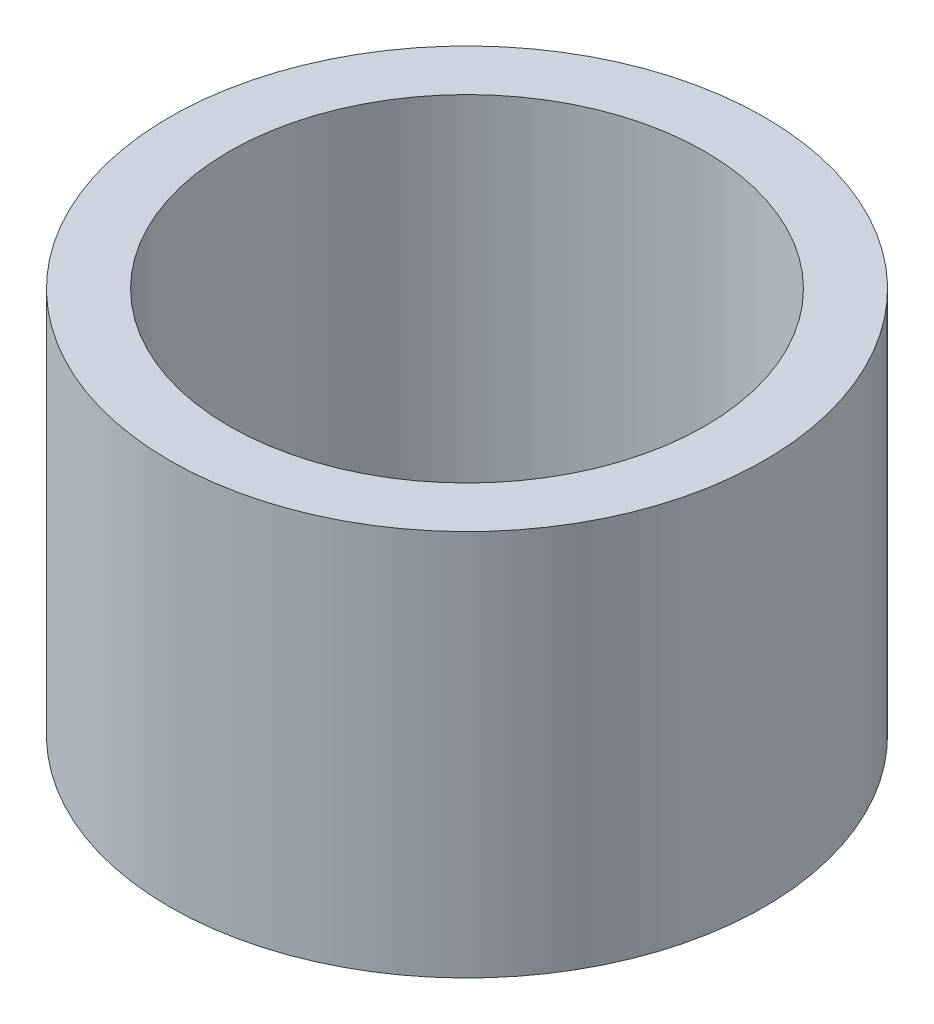
ISO-10303-21;
HEADER;
FILE_DESCRIPTION(('STEP AP214'),'2;1');
FILE_NAME('part.step','',(''),(''),'','','');
FILE_SCHEMA(('AUTOMOTIVE_DESIGN { 1 0 10303 214 1 1 1 1 }'));
ENDSEC;
DATA;
#1=APPLICATION_CONTEXT('core data for automotive mechanical design processes');
#2=APPLICATION_PROTOCOL_DEFINITION('international standard','automotive_design',2000,#1);
#3=PRODUCT_CONTEXT('',#1,'mechanical');
#4=PRODUCT('Part','Part','',(#3));
#5=PRODUCT_RELATED_PRODUCT_CATEGORY('part','',(#4));
#6=PRODUCT_DEFINITION_FORMATION('','',#4);
#7=PRODUCT_DEFINITION_CONTEXT('part definition',#1,'design');
#8=PRODUCT_DEFINITION('design','',#6,#7);
#9=PRODUCT_DEFINITION_SHAPE('','',#8);
#10=(LENGTH_UNIT() NAMED_UNIT(*) SI_UNIT(.MILLI.,.METRE.));
#11=(NAMED_UNIT(*) PLANE_ANGLE_UNIT() SI_UNIT($,.RADIAN.));
#12=(NAMED_UNIT(*) SI_UNIT($,.STERADIAN.) SOLID_ANGLE_UNIT());
#13=UNCERTAINTY_MEASURE_WITH_UNIT(LENGTH_MEASURE(1.E-05),#10,'distance_accuracy_value','');
#14=(GEOMETRIC_REPRESENTATION_CONTEXT(3) GLOBAL_UNCERTAINTY_ASSIGNED_CONTEXT((#13)) GLOBAL_UNIT_ASSIGNED_CONTEXT((#10,
#11,#12)) REPRESENTATION_CONTEXT('',''));
#15=CARTESIAN_POINT('',(0.,0.,0.));
#16=DIRECTION('',(0.,0.,1.));
#17=DIRECTION('',(1.,0.,0.));
#18=AXIS2_PLACEMENT_3D('',#15,#16,#17);
#19=CARTESIAN_POINT('',(0.,13.,0.));
#20=DIRECTION('',(0.,1.,0.));
#21=DIRECTION('',(0.,0.,1.));
#22=AXIS2_PLACEMENT_3D('',#19,#20,#21);
#23=PLANE('',#22);
#24=CARTESIAN_POINT('',(0.,13.,0.));
#25=DIRECTION('',(0.,1.,0.));
#26=DIRECTION('',(0.,0.,1.));
#27=AXIS2_PLACEMENT_3D('',#24,#25,#26);
#28=CIRCLE('',#27,10.);
#29=CARTESIAN_POINT('',(0.,13.,-10.));
#30=VERTEX_POINT('',#29);
#31=EDGE_CURVE('E11',#30,#30,#28,.T.);
#32=ORIENTED_EDGE('',*,*,#31,.T.);
#33=EDGE_LOOP('',(#32));
#34=FACE_BOUND('',#33,.T.);
#35=CARTESIAN_POINT('',(0.,13.,0.));
#36=DIRECTION('',(0.,-1.,0.));
#37=DIRECTION('',(0.,0.,-1.));
#38=AXIS2_PLACEMENT_3D('',#35,#36,#37);
#39=CIRCLE('',#38,8.);
#40=CARTESIAN_POINT('',(0.,13.,-8.));
#41=VERTEX_POINT('',#40);
#42=EDGE_CURVE('E65',#41,#41,#39,.T.);
#43=ORIENTED_EDGE('',*,*,#42,.T.);
#44=EDGE_LOOP('',(#43));
#45=FACE_BOUND('',#44,.T.);
#46=ADVANCED_FACE('F52',(#34,#45),#23,.T.);
#47=CARTESIAN_POINT('',(0.,0.,0.));
#48=DIRECTION('',(0.,1.,0.));
#49=DIRECTION('',(0.,0.,1.));
#50=AXIS2_PLACEMENT_3D('',#47,#48,#49);
#51=PLANE('',#50);
#52=CARTESIAN_POINT('',(0.,0.,0.));
#53=DIRECTION('',(0.,1.,0.));
#54=DIRECTION('',(0.,0.,1.));
#55=AXIS2_PLACEMENT_3D('',#52,#53,#54);
#56=CIRCLE('',#55,10.);
#57=CARTESIAN_POINT('',(0.,0.,-10.));
#58=VERTEX_POINT('',#57);
#59=EDGE_CURVE('E56',#58,#58,#56,.T.);
#60=ORIENTED_EDGE('',*,*,#59,.F.);
#61=EDGE_LOOP('',(#60));
#62=FACE_BOUND('',#61,.T.);
#63=CARTESIAN_POINT('',(0.,0.,0.));
#64=DIRECTION('',(0.,1.,0.));
#65=DIRECTION('',(0.,0.,1.));
#66=AXIS2_PLACEMENT_3D('',#63,#64,#65);
#67=CIRCLE('',#66,8.);
#68=CARTESIAN_POINT('',(0.,0.,-8.));
#69=VERTEX_POINT('',#68);
#70=EDGE_CURVE('E67',#69,#69,#67,.T.);
#71=ORIENTED_EDGE('',*,*,#70,.T.);
#72=EDGE_LOOP('',(#71));
#73=FACE_BOUND('',#72,.T.);
#74=ADVANCED_FACE('F83',(#62,#73),#51,.F.);
#75=CARTESIAN_POINT('',(0.,13.,0.));
#76=DIRECTION('',(0.,-1.,0.));
#77=DIRECTION('',(0.,0.,-1.));
#78=AXIS2_PLACEMENT_3D('',#75,#76,#77);
#79=CYLINDRICAL_SURFACE('',#78,10.);
#80=CARTESIAN_POINT('',(0.,13.,-10.));
#81=CARTESIAN_POINT('',(0.,12.8645833333333,-10.));
#82=CARTESIAN_POINT('',(0.,12.7291666666667,-10.));
#83=CARTESIAN_POINT('',(0.,12.4583333333333,-10.));
#84=CARTESIAN_POINT('',(0.,12.3229166666667,-10.));
#85=CARTESIAN_POINT('',(0.,12.0520833333333,-10.));
#86=CARTESIAN_POINT('',(0.,11.9166666666667,-10.));
#87=CARTESIAN_POINT('',(0.,11.6458333333333,-10.));
#88=CARTESIAN_POINT('',(0.,11.5104166666667,-10.));
#89=CARTESIAN_POINT('',(0.,11.2395833333333,-10.));
#90=CARTESIAN_POINT('',(0.,11.1041666666667,-10.));
#91=CARTESIAN_POINT('',(0.,10.8333333333333,-10.));
#92=CARTESIAN_POINT('',(0.,10.6979166666667,-10.));
#93=CARTESIAN_POINT('',(0.,10.4270833333333,-10.));
#94=CARTESIAN_POINT('',(0.,10.2916666666667,-10.));
#95=CARTESIAN_POINT('',(0.,10.0208333333333,-10.));
#96=CARTESIAN_POINT('',(0.,9.88541666666667,-10.));
#97=CARTESIAN_POINT('',(0.,9.61458333333333,-10.));
#98=CARTESIAN_POINT('',(0.,9.47916666666667,-10.));
#99=CARTESIAN_POINT('',(0.,9.20833333333333,-10.));
#100=CARTESIAN_POINT('',(0.,9.07291666666666,-10.));
#101=CARTESIAN_POINT('',(0.,8.80208333333333,-10.));
#102=CARTESIAN_POINT('',(0.,8.66666666666667,-10.));
#103=CARTESIAN_POINT('',(0.,8.39583333333333,-10.));
#104=CARTESIAN_POINT('',(0.,8.26041666666667,-10.));
#105=CARTESIAN_POINT('',(0.,7.98958333333333,-10.));
#106=CARTESIAN_POINT('',(0.,7.85416666666667,-10.));
#107=CARTESIAN_POINT('',(0.,7.58333333333333,-10.));
#108=CARTESIAN_POINT('',(0.,7.44791666666667,-10.));
#109=CARTESIAN_POINT('',(0.,7.17708333333333,-10.));
#110=CARTESIAN_POINT('',(0.,7.04166666666667,-10.));
#111=CARTESIAN_POINT('',(0.,6.77083333333333,-10.));
#112=CARTESIAN_POINT('',(0.,6.63541666666667,-10.));
#113=CARTESIAN_POINT('',(0.,6.36458333333333,-10.));
#114=CARTESIAN_POINT('',(0.,6.22916666666667,-10.));
#115=CARTESIAN_POINT('',(0.,5.95833333333333,-10.));
#116=CARTESIAN_POINT('',(0.,5.82291666666667,-10.));
#117=CARTESIAN_POINT('',(0.,5.55208333333333,-10.));
#118=CARTESIAN_POINT('',(0.,5.41666666666667,-10.));
#119=CARTESIAN_POINT('',(0.,5.14583333333333,-10.));
#120=CARTESIAN_POINT('',(0.,5.01041666666667,-10.));
#121=CARTESIAN_POINT('',(0.,4.73958333333333,-10.));
#122=CARTESIAN_POINT('',(0.,4.60416666666667,-10.));
#123=CARTESIAN_POINT('',(0.,4.33333333333333,-10.));
#124=CARTESIAN_POINT('',(0.,4.19791666666667,-10.));
#125=CARTESIAN_POINT('',(0.,3.92708333333333,-10.));
#126=CARTESIAN_POINT('',(0.,3.79166666666667,-10.));
#127=CARTESIAN_POINT('',(0.,3.52083333333333,-10.));
#128=CARTESIAN_POINT('',(0.,3.38541666666667,-10.));
#129=CARTESIAN_POINT('',(0.,3.11458333333333,-10.));
#130=CARTESIAN_POINT('',(0.,2.97916666666667,-10.));
#131=CARTESIAN_POINT('',(0.,2.70833333333333,-10.));
#132=CARTESIAN_POINT('',(0.,2.57291666666667,-10.));
#133=CARTESIAN_POINT('',(0.,2.30208333333333,-10.));
#134=CARTESIAN_POINT('',(0.,2.16666666666667,-10.));
#135=CARTESIAN_POINT('',(0.,1.89583333333333,-10.));
#136=CARTESIAN_POINT('',(0.,1.76041666666667,-10.));
#137=CARTESIAN_POINT('',(0.,1.48958333333333,-10.));
#138=CARTESIAN_POINT('',(0.,1.35416666666667,-10.));
#139=CARTESIAN_POINT('',(0.,1.08333333333333,-10.));
#140=CARTESIAN_POINT('',(0.,0.947916666666667,-10.));
#141=CARTESIAN_POINT('',(0.,0.677083333333334,-10.));
#142=CARTESIAN_POINT('',(0.,0.541666666666667,-10.));
#143=CARTESIAN_POINT('',(0.,0.270833333333334,-10.));
#144=CARTESIAN_POINT('',(0.,0.135416666666667,-10.));
#145=CARTESIAN_POINT('',(0.,0.,-10.));
#146=B_SPLINE_CURVE_WITH_KNOTS('',3,(#80,#81,#82,#83,#84,#85,#86,#87,#88,#89,#90,#91,#92,#93,
#94,#95,#96,#97,#98,#99,#100,#101,#102,#103,#104,#105,#106,#107,#108,#109,#110,#111,#112,#113,
#114,#115,#116,#117,#118,#119,#120,#121,#122,#123,#124,#125,#126,#127,#128,#129,#130,#131,#132,
#133,#134,#135,#136,#137,#138,#139,#140,#141,#142,#143,#144,#145),.UNSPECIFIED.,.F.,.F.,(4,2,2,
2,2,2,2,2,2,2,2,2,2,2,2,2,2,2,2,2,2,2,2,2,2,2,2,2,2,2,2,2,4),(0.,0.40625,0.812500000000001,
1.21875,1.625,2.03125,2.4375,2.84375,3.25,3.65625,4.0625,4.46875,4.875,5.28125,5.6875,6.09375,
6.5,6.90625,7.3125,7.71875,8.125,8.53125,8.9375,9.34375,9.75,10.15625,10.5625,10.96875,11.375,
11.78125,12.1875,12.59375,13.),.UNSPECIFIED.);
#147=EDGE_CURVE('BSEAM54',#30,#58,#146,.T.);
#148=ORIENTED_EDGE('',*,*,#31,.F.);
#149=ORIENTED_EDGE('',*,*,#59,.T.);
#150=ORIENTED_EDGE('',*,*,#147,.T.);
#151=ORIENTED_EDGE('',*,*,#147,.F.);
#152=EDGE_LOOP('',(#148,#150,#149,#151));
#153=FACE_BOUND('',#152,.T.);
#154=ADVANCED_FACE('F54',(#153),#79,.T.);
#155=CARTESIAN_POINT('',(0.,13.,0.));
#156=DIRECTION('',(0.,-1.,0.));
#157=DIRECTION('',(0.,0.,-1.));
#158=AXIS2_PLACEMENT_3D('',#155,#156,#157);
#159=CYLINDRICAL_SURFACE('',#158,8.);
#160=CARTESIAN_POINT('',(0.,0.,-8.));
#161=CARTESIAN_POINT('',(0.,0.135416666666667,-8.));
#162=CARTESIAN_POINT('',(0.,0.270833333333334,-8.));
#163=CARTESIAN_POINT('',(0.,0.541666666666667,-8.));
#164=CARTESIAN_POINT('',(0.,0.677083333333334,-8.));
#165=CARTESIAN_POINT('',(0.,0.947916666666667,-8.));
#166=CARTESIAN_POINT('',(0.,1.08333333333333,-8.));
#167=CARTESIAN_POINT('',(0.,1.35416666666667,-8.));
#168=CARTESIAN_POINT('',(0.,1.48958333333333,-8.));
#169=CARTESIAN_POINT('',(0.,1.76041666666667,-8.));
#170=CARTESIAN_POINT('',(0.,1.89583333333333,-8.));
#171=CARTESIAN_POINT('',(0.,2.16666666666667,-8.));
#172=CARTESIAN_POINT('',(0.,2.30208333333333,-8.));
#173=CARTESIAN_POINT('',(0.,2.57291666666667,-8.));
#174=CARTESIAN_POINT('',(0.,2.70833333333333,-8.));
#175=CARTESIAN_POINT('',(0.,2.97916666666667,-8.));
#176=CARTESIAN_POINT('',(0.,3.11458333333333,-8.));
#177=CARTESIAN_POINT('',(0.,3.38541666666667,-8.));
#178=CARTESIAN_POINT('',(0.,3.52083333333333,-8.));
#179=CARTESIAN_POINT('',(0.,3.79166666666667,-8.));
#180=CARTESIAN_POINT('',(0.,3.92708333333333,-8.));
#181=CARTESIAN_POINT('',(0.,4.19791666666667,-8.));
#182=CARTESIAN_POINT('',(0.,4.33333333333333,-8.));
#183=CARTESIAN_POINT('',(0.,4.60416666666667,-8.));
#184=CARTESIAN_POINT('',(0.,4.73958333333333,-8.));
#185=CARTESIAN_POINT('',(0.,5.01041666666667,-8.));
#186=CARTESIAN_POINT('',(0.,5.14583333333333,-8.));
#187=CARTESIAN_POINT('',(0.,5.41666666666667,-8.));
#188=CARTESIAN_POINT('',(0.,5.55208333333333,-8.));
#189=CARTESIAN_POINT('',(0.,5.82291666666667,-8.));
#190=CARTESIAN_POINT('',(0.,5.95833333333333,-8.));
#191=CARTESIAN_POINT('',(0.,6.22916666666667,-8.));
#192=CARTESIAN_POINT('',(0.,6.36458333333333,-8.));
#193=CARTESIAN_POINT('',(0.,6.63541666666667,-8.));
#194=CARTESIAN_POINT('',(0.,6.77083333333333,-8.));
#195=CARTESIAN_POINT('',(0.,7.04166666666667,-8.));
#196=CARTESIAN_POINT('',(0.,7.17708333333333,-8.));
#197=CARTESIAN_POINT('',(0.,7.44791666666667,-8.));
#198=CARTESIAN_POINT('',(0.,7.58333333333333,-8.));
#199=CARTESIAN_POINT('',(0.,7.85416666666667,-8.));
#200=CARTESIAN_POINT('',(0.,7.98958333333333,-8.));
#201=CARTESIAN_POINT('',(0.,8.26041666666667,-8.));
#202=CARTESIAN_POINT('',(0.,8.39583333333333,-8.));
#203=CARTESIAN_POINT('',(0.,8.66666666666667,-8.));
#204=CARTESIAN_POINT('',(0.,8.80208333333333,-8.));
#205=CARTESIAN_POINT('',(0.,9.07291666666667,-8.));
#206=CARTESIAN_POINT('',(0.,9.20833333333333,-8.));
#207=CARTESIAN_POINT('',(0.,9.47916666666667,-8.));
#208=CARTESIAN_POINT('',(0.,9.61458333333333,-8.));
#209=CARTESIAN_POINT('',(0.,9.88541666666667,-8.));
#210=CARTESIAN_POINT('',(0.,10.0208333333333,-8.));
#211=CARTESIAN_POINT('',(0.,10.2916666666667,-8.));
#212=CARTESIAN_POINT('',(0.,10.4270833333333,-8.));
#213=CARTESIAN_POINT('',(0.,10.6979166666667,-8.));
#214=CARTESIAN_POINT('',(0.,10.8333333333333,-8.));
#215=CARTESIAN_POINT('',(0.,11.1041666666667,-8.));
#216=CARTESIAN_POINT('',(0.,11.2395833333333,-8.));
#217=CARTESIAN_POINT('',(0.,11.5104166666667,-8.));
#218=CARTESIAN_POINT('',(0.,11.6458333333333,-8.));
#219=CARTESIAN_POINT('',(0.,11.9166666666667,-8.));
#220=CARTESIAN_POINT('',(0.,12.0520833333333,-8.));
#221=CARTESIAN_POINT('',(0.,12.3229166666667,-8.));
#222=CARTESIAN_POINT('',(0.,12.4583333333333,-8.));
#223=CARTESIAN_POINT('',(0.,12.7291666666667,-8.));
#224=CARTESIAN_POINT('',(0.,12.8645833333333,-8.));
#225=CARTESIAN_POINT('',(0.,13.,-8.));
#226=B_SPLINE_CURVE_WITH_KNOTS('',3,(#160,#161,#162,#163,#164,#165,#166,#167,#168,#169,#170,
#171,#172,#173,#174,#175,#176,#177,#178,#179,#180,#181,#182,#183,#184,#185,#186,#187,#188,#189,
#190,#191,#192,#193,#194,#195,#196,#197,#198,#199,#200,#201,#202,#203,#204,#205,#206,#207,#208,
#209,#210,#211,#212,#213,#214,#215,#216,#217,#218,#219,#220,#221,#222,#223,#224,#225),
.UNSPECIFIED.,.F.,.F.,(4,2,2,2,2,2,2,2,2,2,2,2,2,2,2,2,2,2,2,2,2,2,2,2,2,2,2,2,2,2,2,2,4),(0.,
0.40625,0.812500000000001,1.21875,1.625,2.03125,2.4375,2.84375,3.25,3.65625,4.0625,4.46875,
4.875,5.28125,5.6875,6.09375,6.5,6.90625,7.3125,7.71875,8.125,8.53125,8.9375,9.34375,9.75,
10.15625,10.5625,10.96875,11.375,11.78125,12.1875,12.59375,13.),.UNSPECIFIED.);
#227=EDGE_CURVE('BSEAM76',#69,#41,#226,.T.);
#228=ORIENTED_EDGE('',*,*,#70,.F.);
#229=ORIENTED_EDGE('',*,*,#42,.F.);
#230=ORIENTED_EDGE('',*,*,#227,.T.);
#231=ORIENTED_EDGE('',*,*,#227,.F.);
#232=EDGE_LOOP('',(#228,#230,#229,#231));
#233=FACE_BOUND('',#232,.T.);
#234=ADVANCED_FACE('F76',(#233),#159,.F.);
#235=CLOSED_SHELL('',(#46,#74,#154,#234));
#236=MANIFOLD_SOLID_BREP('B2',#235);
#237=ADVANCED_BREP_SHAPE_REPRESENTATION('',(#18,#236),#14);
#238=SHAPE_DEFINITION_REPRESENTATION(#9,#237);
ENDSEC;
END-ISO-10303-21;
